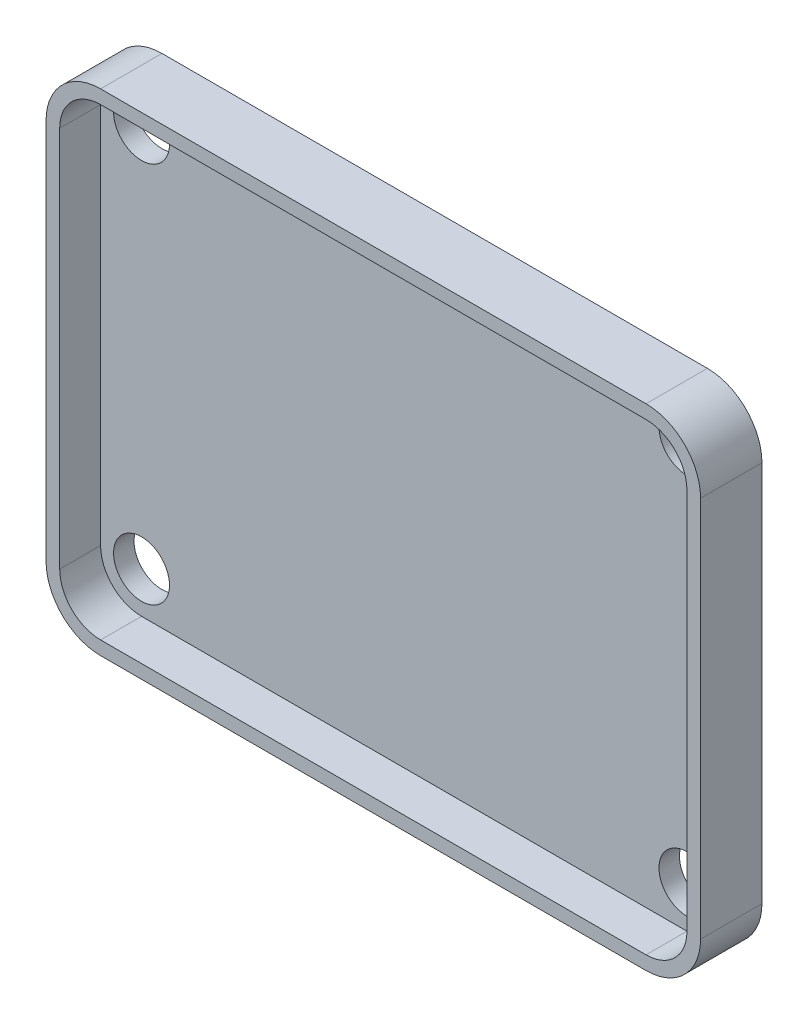
ISO-10303-21;
HEADER;
FILE_DESCRIPTION(('STEP AP214'),'2;1');
FILE_NAME('part.step','',(''),(''),'','','');
FILE_SCHEMA(('AUTOMOTIVE_DESIGN { 1 0 10303 214 1 1 1 1 }'));
ENDSEC;
DATA;
#1=APPLICATION_CONTEXT('core data for automotive mechanical design processes');
#2=APPLICATION_PROTOCOL_DEFINITION('international standard','automotive_design',2000,#1);
#3=PRODUCT_CONTEXT('',#1,'mechanical');
#4=PRODUCT('Part','Part','',(#3));
#5=PRODUCT_RELATED_PRODUCT_CATEGORY('part','',(#4));
#6=PRODUCT_DEFINITION_FORMATION('','',#4);
#7=PRODUCT_DEFINITION_CONTEXT('part definition',#1,'design');
#8=PRODUCT_DEFINITION('design','',#6,#7);
#9=PRODUCT_DEFINITION_SHAPE('','',#8);
#10=(LENGTH_UNIT() NAMED_UNIT(*) SI_UNIT(.MILLI.,.METRE.));
#11=(NAMED_UNIT(*) PLANE_ANGLE_UNIT() SI_UNIT($,.RADIAN.));
#12=(NAMED_UNIT(*) SI_UNIT($,.STERADIAN.) SOLID_ANGLE_UNIT());
#13=UNCERTAINTY_MEASURE_WITH_UNIT(LENGTH_MEASURE(1.E-05),#10,'distance_accuracy_value','');
#14=(GEOMETRIC_REPRESENTATION_CONTEXT(3) GLOBAL_UNCERTAINTY_ASSIGNED_CONTEXT((#13)) GLOBAL_UNIT_ASSIGNED_CONTEXT((#10,
#11,#12)) REPRESENTATION_CONTEXT('',''));
#15=CARTESIAN_POINT('',(0.,0.,0.));
#16=DIRECTION('',(0.,0.,1.));
#17=DIRECTION('',(1.,0.,0.));
#18=AXIS2_PLACEMENT_3D('',#15,#16,#17);
#19=CARTESIAN_POINT('',(-20.,-14.,2.25));
#20=DIRECTION('',(0.,0.,-1.));
#21=DIRECTION('',(-1.,0.,0.));
#22=AXIS2_PLACEMENT_3D('',#19,#20,#21);
#23=CYLINDRICAL_SURFACE('',#22,2.05);
#24=CARTESIAN_POINT('',(-20.,-14.,-2.25));
#25=DIRECTION('',(0.,0.,1.));
#26=DIRECTION('',(1.,0.,0.));
#27=AXIS2_PLACEMENT_3D('',#24,#25,#26);
#28=CIRCLE('',#27,2.05);
#29=CARTESIAN_POINT('',(-17.95,-14.,-2.25));
#30=VERTEX_POINT('',#29);
#31=EDGE_CURVE('E148',#30,#30,#28,.T.);
#32=ORIENTED_EDGE('',*,*,#31,.F.);
#33=EDGE_LOOP('',(#32));
#34=FACE_BOUND('',#33,.T.);
#35=CARTESIAN_POINT('',(-20.,-14.,-0.75));
#36=DIRECTION('',(0.,0.,1.));
#37=DIRECTION('',(1.,0.,0.));
#38=AXIS2_PLACEMENT_3D('',#35,#36,#37);
#39=CIRCLE('',#38,2.05);
#40=CARTESIAN_POINT('',(-17.95,-14.,-0.75));
#41=VERTEX_POINT('',#40);
#42=EDGE_CURVE('E206',#41,#41,#39,.T.);
#43=ORIENTED_EDGE('',*,*,#42,.T.);
#44=EDGE_LOOP('',(#43));
#45=FACE_BOUND('',#44,.T.);
#46=ADVANCED_FACE('F35',(#34,#45),#23,.F.);
#47=CARTESIAN_POINT('',(-20.,14.,2.25));
#48=DIRECTION('',(0.,0.,-1.));
#49=DIRECTION('',(-1.,0.,0.));
#50=AXIS2_PLACEMENT_3D('',#47,#48,#49);
#51=CYLINDRICAL_SURFACE('',#50,2.05);
#52=CARTESIAN_POINT('',(-20.,14.,-2.25));
#53=DIRECTION('',(0.,0.,1.));
#54=DIRECTION('',(1.,0.,0.));
#55=AXIS2_PLACEMENT_3D('',#52,#53,#54);
#56=CIRCLE('',#55,2.05);
#57=CARTESIAN_POINT('',(-17.95,14.,-2.25));
#58=VERTEX_POINT('',#57);
#59=EDGE_CURVE('E197',#58,#58,#56,.T.);
#60=ORIENTED_EDGE('',*,*,#59,.F.);
#61=EDGE_LOOP('',(#60));
#62=FACE_BOUND('',#61,.T.);
#63=CARTESIAN_POINT('',(-20.,14.,-0.75));
#64=DIRECTION('',(0.,0.,1.));
#65=DIRECTION('',(1.,0.,0.));
#66=AXIS2_PLACEMENT_3D('',#63,#64,#65);
#67=CIRCLE('',#66,2.05);
#68=CARTESIAN_POINT('',(-17.95,14.,-0.75));
#69=VERTEX_POINT('',#68);
#70=EDGE_CURVE('E209',#69,#69,#67,.T.);
#71=ORIENTED_EDGE('',*,*,#70,.T.);
#72=EDGE_LOOP('',(#71));
#73=FACE_BOUND('',#72,.T.);
#74=ADVANCED_FACE('F360',(#62,#73),#51,.F.);
#75=CARTESIAN_POINT('',(20.,14.,2.25));
#76=DIRECTION('',(0.,0.,-1.));
#77=DIRECTION('',(-1.,0.,0.));
#78=AXIS2_PLACEMENT_3D('',#75,#76,#77);
#79=CYLINDRICAL_SURFACE('',#78,2.05);
#80=CARTESIAN_POINT('',(20.,14.,-2.25));
#81=DIRECTION('',(0.,0.,1.));
#82=DIRECTION('',(1.,0.,0.));
#83=AXIS2_PLACEMENT_3D('',#80,#81,#82);
#84=CIRCLE('',#83,2.05);
#85=CARTESIAN_POINT('',(22.05,14.,-2.25));
#86=VERTEX_POINT('',#85);
#87=EDGE_CURVE('E200',#86,#86,#84,.T.);
#88=ORIENTED_EDGE('',*,*,#87,.F.);
#89=EDGE_LOOP('',(#88));
#90=FACE_BOUND('',#89,.T.);
#91=CARTESIAN_POINT('',(20.,14.,-0.75));
#92=DIRECTION('',(0.,0.,1.));
#93=DIRECTION('',(1.,0.,0.));
#94=AXIS2_PLACEMENT_3D('',#91,#92,#93);
#95=CIRCLE('',#94,2.05);
#96=CARTESIAN_POINT('',(22.05,14.,-0.75));
#97=VERTEX_POINT('',#96);
#98=EDGE_CURVE('E212',#97,#97,#95,.T.);
#99=ORIENTED_EDGE('',*,*,#98,.T.);
#100=EDGE_LOOP('',(#99));
#101=FACE_BOUND('',#100,.T.);
#102=ADVANCED_FACE('F366',(#90,#101),#79,.F.);
#103=CARTESIAN_POINT('',(20.,-14.,2.25));
#104=DIRECTION('',(0.,0.,-1.));
#105=DIRECTION('',(-1.,0.,0.));
#106=AXIS2_PLACEMENT_3D('',#103,#104,#105);
#107=CYLINDRICAL_SURFACE('',#106,2.05);
#108=CARTESIAN_POINT('',(20.,-14.,-2.25));
#109=DIRECTION('',(0.,0.,1.));
#110=DIRECTION('',(1.,0.,0.));
#111=AXIS2_PLACEMENT_3D('',#108,#109,#110);
#112=CIRCLE('',#111,2.05);
#113=CARTESIAN_POINT('',(22.05,-14.,-2.25));
#114=VERTEX_POINT('',#113);
#115=EDGE_CURVE('E203',#114,#114,#112,.T.);
#116=ORIENTED_EDGE('',*,*,#115,.F.);
#117=EDGE_LOOP('',(#116));
#118=FACE_BOUND('',#117,.T.);
#119=CARTESIAN_POINT('',(20.,-14.,-0.75));
#120=DIRECTION('',(0.,0.,1.));
#121=DIRECTION('',(1.,0.,0.));
#122=AXIS2_PLACEMENT_3D('',#119,#120,#121);
#123=CIRCLE('',#122,2.05);
#124=CARTESIAN_POINT('',(22.05,-14.,-0.75));
#125=VERTEX_POINT('',#124);
#126=EDGE_CURVE('E39',#125,#125,#123,.T.);
#127=ORIENTED_EDGE('',*,*,#126,.T.);
#128=EDGE_LOOP('',(#127));
#129=FACE_BOUND('',#128,.T.);
#130=ADVANCED_FACE('F375',(#118,#129),#107,.F.);
#131=CARTESIAN_POINT('',(-20.,-14.,2.25));
#132=DIRECTION('',(0.,0.,1.));
#133=DIRECTION('',(1.,0.,0.));
#134=AXIS2_PLACEMENT_3D('',#131,#132,#133);
#135=PLANE('',#134);
#136=CARTESIAN_POINT('',(20.,-14.,2.25));
#137=DIRECTION('',(0.,0.,1.));
#138=DIRECTION('',(1.,0.,0.));
#139=AXIS2_PLACEMENT_3D('',#136,#137,#138);
#140=CIRCLE('',#139,3.);
#141=CARTESIAN_POINT('',(20.,-17.,2.25));
#142=VERTEX_POINT('',#141);
#143=CARTESIAN_POINT('',(23.,-14.,2.25));
#144=VERTEX_POINT('',#143);
#145=EDGE_CURVE('E51',#142,#144,#140,.T.);
#146=ORIENTED_EDGE('',*,*,#145,.F.);
#147=DIRECTION('',(1.,0.,0.));
#148=VECTOR('',#147,1.);
#149=CARTESIAN_POINT('',(-20.,-17.,2.25));
#150=LINE('',#149,#148);
#151=CARTESIAN_POINT('',(-20.,-17.,2.25));
#152=VERTEX_POINT('',#151);
#153=EDGE_CURVE('E222',#152,#142,#150,.T.);
#154=ORIENTED_EDGE('',*,*,#153,.F.);
#155=CARTESIAN_POINT('',(-20.,-14.,2.25));
#156=DIRECTION('',(0.,0.,1.));
#157=DIRECTION('',(1.,0.,0.));
#158=AXIS2_PLACEMENT_3D('',#155,#156,#157);
#159=CIRCLE('',#158,3.);
#160=CARTESIAN_POINT('',(-23.,-14.,2.25));
#161=VERTEX_POINT('',#160);
#162=EDGE_CURVE('E245',#161,#152,#159,.T.);
#163=ORIENTED_EDGE('',*,*,#162,.F.);
#164=DIRECTION('',(0.,-1.,0.));
#165=VECTOR('',#164,1.);
#166=CARTESIAN_POINT('',(-23.,14.,2.25));
#167=LINE('',#166,#165);
#168=CARTESIAN_POINT('',(-23.,14.,2.25));
#169=VERTEX_POINT('',#168);
#170=EDGE_CURVE('E248',#169,#161,#167,.T.);
#171=ORIENTED_EDGE('',*,*,#170,.F.);
#172=CARTESIAN_POINT('',(-20.,14.,2.25));
#173=DIRECTION('',(0.,0.,1.));
#174=DIRECTION('',(1.,0.,0.));
#175=AXIS2_PLACEMENT_3D('',#172,#173,#174);
#176=CIRCLE('',#175,3.);
#177=CARTESIAN_POINT('',(-20.,17.,2.25));
#178=VERTEX_POINT('',#177);
#179=EDGE_CURVE('E251',#178,#169,#176,.T.);
#180=ORIENTED_EDGE('',*,*,#179,.F.);
#181=DIRECTION('',(-1.,0.,0.));
#182=VECTOR('',#181,1.);
#183=CARTESIAN_POINT('',(20.,17.,2.25));
#184=LINE('',#183,#182);
#185=CARTESIAN_POINT('',(20.,17.,2.25));
#186=VERTEX_POINT('',#185);
#187=EDGE_CURVE('E254',#186,#178,#184,.T.);
#188=ORIENTED_EDGE('',*,*,#187,.F.);
#189=CARTESIAN_POINT('',(20.,14.,2.25));
#190=DIRECTION('',(0.,0.,1.));
#191=DIRECTION('',(1.,0.,0.));
#192=AXIS2_PLACEMENT_3D('',#189,#190,#191);
#193=CIRCLE('',#192,3.);
#194=CARTESIAN_POINT('',(23.,14.,2.25));
#195=VERTEX_POINT('',#194);
#196=EDGE_CURVE('E257',#195,#186,#193,.T.);
#197=ORIENTED_EDGE('',*,*,#196,.F.);
#198=DIRECTION('',(0.,1.,0.));
#199=VECTOR('',#198,1.);
#200=CARTESIAN_POINT('',(23.,-14.,2.25));
#201=LINE('',#200,#199);
#202=EDGE_CURVE('E260',#144,#195,#201,.T.);
#203=ORIENTED_EDGE('',*,*,#202,.F.);
#204=EDGE_LOOP('',(#146,#154,#163,#171,#180,#188,#197,#203));
#205=FACE_BOUND('',#204,.T.);
#206=CARTESIAN_POINT('',(-20.,-14.,2.25));
#207=DIRECTION('',(0.,0.,1.));
#208=DIRECTION('',(1.,0.,0.));
#209=AXIS2_PLACEMENT_3D('',#206,#207,#208);
#210=CIRCLE('',#209,4.);
#211=CARTESIAN_POINT('',(-24.,-14.,2.25));
#212=VERTEX_POINT('',#211);
#213=CARTESIAN_POINT('',(-20.,-18.,2.25));
#214=VERTEX_POINT('',#213);
#215=EDGE_CURVE('E160',#212,#214,#210,.T.);
#216=ORIENTED_EDGE('',*,*,#215,.T.);
#217=DIRECTION('',(1.,0.,0.));
#218=VECTOR('',#217,1.);
#219=CARTESIAN_POINT('',(-20.,-18.,2.25));
#220=LINE('',#219,#218);
#221=CARTESIAN_POINT('',(20.,-18.,2.25));
#222=VERTEX_POINT('',#221);
#223=EDGE_CURVE('E101',#214,#222,#220,.T.);
#224=ORIENTED_EDGE('',*,*,#223,.T.);
#225=CARTESIAN_POINT('',(20.,-14.,2.25));
#226=DIRECTION('',(0.,0.,1.));
#227=DIRECTION('',(1.,0.,0.));
#228=AXIS2_PLACEMENT_3D('',#225,#226,#227);
#229=CIRCLE('',#228,4.);
#230=CARTESIAN_POINT('',(24.,-14.,2.25));
#231=VERTEX_POINT('',#230);
#232=EDGE_CURVE('E176',#222,#231,#229,.T.);
#233=ORIENTED_EDGE('',*,*,#232,.T.);
#234=DIRECTION('',(0.,1.,0.));
#235=VECTOR('',#234,1.);
#236=CARTESIAN_POINT('',(24.,-14.,2.25));
#237=LINE('',#236,#235);
#238=CARTESIAN_POINT('',(24.,14.,2.25));
#239=VERTEX_POINT('',#238);
#240=EDGE_CURVE('E189',#231,#239,#237,.T.);
#241=ORIENTED_EDGE('',*,*,#240,.T.);
#242=CARTESIAN_POINT('',(20.,14.,2.25));
#243=DIRECTION('',(0.,0.,1.));
#244=DIRECTION('',(1.,0.,0.));
#245=AXIS2_PLACEMENT_3D('',#242,#243,#244);
#246=CIRCLE('',#245,4.);
#247=CARTESIAN_POINT('',(20.,18.,2.25));
#248=VERTEX_POINT('',#247);
#249=EDGE_CURVE('E123',#239,#248,#246,.T.);
#250=ORIENTED_EDGE('',*,*,#249,.T.);
#251=DIRECTION('',(-1.,0.,0.));
#252=VECTOR('',#251,1.);
#253=CARTESIAN_POINT('',(-20.,18.,2.25));
#254=LINE('',#253,#252);
#255=CARTESIAN_POINT('',(-20.,18.,2.25));
#256=VERTEX_POINT('',#255);
#257=EDGE_CURVE('E116',#248,#256,#254,.T.);
#258=ORIENTED_EDGE('',*,*,#257,.T.);
#259=CARTESIAN_POINT('',(-20.,14.,2.25));
#260=DIRECTION('',(0.,0.,1.));
#261=DIRECTION('',(1.,0.,0.));
#262=AXIS2_PLACEMENT_3D('',#259,#260,#261);
#263=CIRCLE('',#262,4.);
#264=CARTESIAN_POINT('',(-24.,14.,2.25));
#265=VERTEX_POINT('',#264);
#266=EDGE_CURVE('E120',#256,#265,#263,.T.);
#267=ORIENTED_EDGE('',*,*,#266,.T.);
#268=DIRECTION('',(0.,-1.,0.));
#269=VECTOR('',#268,1.);
#270=CARTESIAN_POINT('',(-24.,-14.,2.25));
#271=LINE('',#270,#269);
#272=EDGE_CURVE('E60',#265,#212,#271,.T.);
#273=ORIENTED_EDGE('',*,*,#272,.T.);
#274=EDGE_LOOP('',(#216,#224,#233,#241,#250,#258,#267,#273));
#275=FACE_BOUND('',#274,.T.);
#276=ADVANCED_FACE('F118',(#205,#275),#135,.T.);
#277=CARTESIAN_POINT('',(-20.,-14.,-2.25));
#278=DIRECTION('',(0.,0.,1.));
#279=DIRECTION('',(1.,0.,0.));
#280=AXIS2_PLACEMENT_3D('',#277,#278,#279);
#281=PLANE('',#280);
#282=ORIENTED_EDGE('',*,*,#87,.T.);
#283=EDGE_LOOP('',(#282));
#284=FACE_BOUND('',#283,.T.);
#285=ORIENTED_EDGE('',*,*,#31,.T.);
#286=EDGE_LOOP('',(#285));
#287=FACE_BOUND('',#286,.T.);
#288=CARTESIAN_POINT('',(-20.,-14.,-2.25));
#289=DIRECTION('',(0.,0.,1.));
#290=DIRECTION('',(1.,0.,0.));
#291=AXIS2_PLACEMENT_3D('',#288,#289,#290);
#292=CIRCLE('',#291,4.);
#293=CARTESIAN_POINT('',(-24.,-14.,-2.25));
#294=VERTEX_POINT('',#293);
#295=CARTESIAN_POINT('',(-20.,-18.,-2.25));
#296=VERTEX_POINT('',#295);
#297=EDGE_CURVE('E144',#294,#296,#292,.T.);
#298=ORIENTED_EDGE('',*,*,#297,.F.);
#299=DIRECTION('',(0.,-1.,0.));
#300=VECTOR('',#299,1.);
#301=CARTESIAN_POINT('',(-24.,-14.,-2.25));
#302=LINE('',#301,#300);
#303=CARTESIAN_POINT('',(-24.,14.,-2.25));
#304=VERTEX_POINT('',#303);
#305=EDGE_CURVE('E93',#304,#294,#302,.T.);
#306=ORIENTED_EDGE('',*,*,#305,.F.);
#307=CARTESIAN_POINT('',(-20.,14.,-2.25));
#308=DIRECTION('',(0.,0.,1.));
#309=DIRECTION('',(1.,0.,0.));
#310=AXIS2_PLACEMENT_3D('',#307,#308,#309);
#311=CIRCLE('',#310,4.);
#312=CARTESIAN_POINT('',(-20.,18.,-2.25));
#313=VERTEX_POINT('',#312);
#314=EDGE_CURVE('E157',#313,#304,#311,.T.);
#315=ORIENTED_EDGE('',*,*,#314,.F.);
#316=DIRECTION('',(-1.,0.,0.));
#317=VECTOR('',#316,1.);
#318=CARTESIAN_POINT('',(-20.,18.,-2.25));
#319=LINE('',#318,#317);
#320=CARTESIAN_POINT('',(20.,18.,-2.25));
#321=VERTEX_POINT('',#320);
#322=EDGE_CURVE('E132',#321,#313,#319,.T.);
#323=ORIENTED_EDGE('',*,*,#322,.F.);
#324=CARTESIAN_POINT('',(20.,14.,-2.25));
#325=DIRECTION('',(0.,0.,1.));
#326=DIRECTION('',(1.,0.,0.));
#327=AXIS2_PLACEMENT_3D('',#324,#325,#326);
#328=CIRCLE('',#327,4.);
#329=CARTESIAN_POINT('',(24.,14.,-2.25));
#330=VERTEX_POINT('',#329);
#331=EDGE_CURVE('E154',#330,#321,#328,.T.);
#332=ORIENTED_EDGE('',*,*,#331,.F.);
#333=DIRECTION('',(0.,1.,0.));
#334=VECTOR('',#333,1.);
#335=CARTESIAN_POINT('',(24.,-14.,-2.25));
#336=LINE('',#335,#334);
#337=CARTESIAN_POINT('',(24.,-14.,-2.25));
#338=VERTEX_POINT('',#337);
#339=EDGE_CURVE('E152',#338,#330,#336,.T.);
#340=ORIENTED_EDGE('',*,*,#339,.F.);
#341=CARTESIAN_POINT('',(20.,-14.,-2.25));
#342=DIRECTION('',(0.,0.,1.));
#343=DIRECTION('',(1.,0.,0.));
#344=AXIS2_PLACEMENT_3D('',#341,#342,#343);
#345=CIRCLE('',#344,4.);
#346=CARTESIAN_POINT('',(20.,-18.,-2.25));
#347=VERTEX_POINT('',#346);
#348=EDGE_CURVE('E150',#347,#338,#345,.T.);
#349=ORIENTED_EDGE('',*,*,#348,.F.);
#350=DIRECTION('',(1.,0.,0.));
#351=VECTOR('',#350,1.);
#352=CARTESIAN_POINT('',(-20.,-18.,-2.25));
#353=LINE('',#352,#351);
#354=EDGE_CURVE('E147',#296,#347,#353,.T.);
#355=ORIENTED_EDGE('',*,*,#354,.F.);
#356=EDGE_LOOP('',(#298,#306,#315,#323,#332,#340,#349,#355));
#357=FACE_BOUND('',#356,.T.);
#358=ORIENTED_EDGE('',*,*,#59,.T.);
#359=EDGE_LOOP('',(#358));
#360=FACE_BOUND('',#359,.T.);
#361=ORIENTED_EDGE('',*,*,#115,.T.);
#362=EDGE_LOOP('',(#361));
#363=FACE_BOUND('',#362,.T.);
#364=ADVANCED_FACE('F180',(#284,#287,#357,#360,#363),#281,.F.);
#365=CARTESIAN_POINT('',(-20.,-14.,2.25));
#366=DIRECTION('',(0.,0.,-1.));
#367=DIRECTION('',(-1.,0.,0.));
#368=AXIS2_PLACEMENT_3D('',#365,#366,#367);
#369=CYLINDRICAL_SURFACE('',#368,4.);
#370=ORIENTED_EDGE('',*,*,#297,.T.);
#371=DIRECTION('',(0.,0.,-1.));
#372=VECTOR('',#371,1.);
#373=CARTESIAN_POINT('',(-20.,-18.,2.25));
#374=LINE('',#373,#372);
#375=EDGE_CURVE('E12',#214,#296,#374,.T.);
#376=ORIENTED_EDGE('',*,*,#375,.F.);
#377=ORIENTED_EDGE('',*,*,#215,.F.);
#378=DIRECTION('',(0.,0.,-1.));
#379=VECTOR('',#378,1.);
#380=CARTESIAN_POINT('',(-24.,-14.,2.25));
#381=LINE('',#380,#379);
#382=EDGE_CURVE('E140',#212,#294,#381,.T.);
#383=ORIENTED_EDGE('',*,*,#382,.T.);
#384=EDGE_LOOP('',(#370,#376,#377,#383));
#385=FACE_BOUND('',#384,.T.);
#386=ADVANCED_FACE('F37',(#385),#369,.T.);
#387=CARTESIAN_POINT('',(-20.,-18.,2.25));
#388=DIRECTION('',(0.,1.,0.));
#389=DIRECTION('',(0.,0.,1.));
#390=AXIS2_PLACEMENT_3D('',#387,#388,#389);
#391=PLANE('',#390);
#392=ORIENTED_EDGE('',*,*,#354,.T.);
#393=DIRECTION('',(0.,0.,-1.));
#394=VECTOR('',#393,1.);
#395=CARTESIAN_POINT('',(20.,-18.,2.25));
#396=LINE('',#395,#394);
#397=EDGE_CURVE('E44',#222,#347,#396,.T.);
#398=ORIENTED_EDGE('',*,*,#397,.F.);
#399=ORIENTED_EDGE('',*,*,#223,.F.);
#400=ORIENTED_EDGE('',*,*,#375,.T.);
#401=EDGE_LOOP('',(#392,#398,#399,#400));
#402=FACE_BOUND('',#401,.T.);
#403=ADVANCED_FACE('F390',(#402),#391,.F.);
#404=CARTESIAN_POINT('',(20.,-14.,2.25));
#405=DIRECTION('',(0.,0.,-1.));
#406=DIRECTION('',(-1.,0.,0.));
#407=AXIS2_PLACEMENT_3D('',#404,#405,#406);
#408=CYLINDRICAL_SURFACE('',#407,4.);
#409=ORIENTED_EDGE('',*,*,#348,.T.);
#410=DIRECTION('',(0.,0.,-1.));
#411=VECTOR('',#410,1.);
#412=CARTESIAN_POINT('',(24.,-14.,2.25));
#413=LINE('',#412,#411);
#414=EDGE_CURVE('E167',#231,#338,#413,.T.);
#415=ORIENTED_EDGE('',*,*,#414,.F.);
#416=ORIENTED_EDGE('',*,*,#232,.F.);
#417=ORIENTED_EDGE('',*,*,#397,.T.);
#418=EDGE_LOOP('',(#409,#415,#416,#417));
#419=FACE_BOUND('',#418,.T.);
#420=ADVANCED_FACE('F174',(#419),#408,.T.);
#421=CARTESIAN_POINT('',(24.,-14.,2.25));
#422=DIRECTION('',(-1.,0.,0.));
#423=DIRECTION('',(0.,0.,1.));
#424=AXIS2_PLACEMENT_3D('',#421,#422,#423);
#425=PLANE('',#424);
#426=ORIENTED_EDGE('',*,*,#339,.T.);
#427=DIRECTION('',(0.,0.,-1.));
#428=VECTOR('',#427,1.);
#429=CARTESIAN_POINT('',(24.,14.,2.25));
#430=LINE('',#429,#428);
#431=EDGE_CURVE('E164',#239,#330,#430,.T.);
#432=ORIENTED_EDGE('',*,*,#431,.F.);
#433=ORIENTED_EDGE('',*,*,#240,.F.);
#434=ORIENTED_EDGE('',*,*,#414,.T.);
#435=EDGE_LOOP('',(#426,#432,#433,#434));
#436=FACE_BOUND('',#435,.T.);
#437=ADVANCED_FACE('F185',(#436),#425,.F.);
#438=CARTESIAN_POINT('',(20.,14.,2.25));
#439=DIRECTION('',(0.,0.,-1.));
#440=DIRECTION('',(-1.,0.,0.));
#441=AXIS2_PLACEMENT_3D('',#438,#439,#440);
#442=CYLINDRICAL_SURFACE('',#441,4.);
#443=ORIENTED_EDGE('',*,*,#331,.T.);
#444=DIRECTION('',(0.,0.,-1.));
#445=VECTOR('',#444,1.);
#446=CARTESIAN_POINT('',(20.,18.,2.25));
#447=LINE('',#446,#445);
#448=EDGE_CURVE('E135',#248,#321,#447,.T.);
#449=ORIENTED_EDGE('',*,*,#448,.F.);
#450=ORIENTED_EDGE('',*,*,#249,.F.);
#451=ORIENTED_EDGE('',*,*,#431,.T.);
#452=EDGE_LOOP('',(#443,#449,#450,#451));
#453=FACE_BOUND('',#452,.T.);
#454=ADVANCED_FACE('F188',(#453),#442,.T.);
#455=CARTESIAN_POINT('',(-20.,18.,2.25));
#456=DIRECTION('',(0.,-1.,0.));
#457=DIRECTION('',(0.,0.,-1.));
#458=AXIS2_PLACEMENT_3D('',#455,#456,#457);
#459=PLANE('',#458);
#460=ORIENTED_EDGE('',*,*,#322,.T.);
#461=DIRECTION('',(0.,0.,-1.));
#462=VECTOR('',#461,1.);
#463=CARTESIAN_POINT('',(-20.,18.,2.25));
#464=LINE('',#463,#462);
#465=EDGE_CURVE('E129',#256,#313,#464,.T.);
#466=ORIENTED_EDGE('',*,*,#465,.F.);
#467=ORIENTED_EDGE('',*,*,#257,.F.);
#468=ORIENTED_EDGE('',*,*,#448,.T.);
#469=EDGE_LOOP('',(#460,#466,#467,#468));
#470=FACE_BOUND('',#469,.T.);
#471=ADVANCED_FACE('F130',(#470),#459,.F.);
#472=CARTESIAN_POINT('',(-20.,14.,2.25));
#473=DIRECTION('',(0.,0.,-1.));
#474=DIRECTION('',(-1.,0.,0.));
#475=AXIS2_PLACEMENT_3D('',#472,#473,#474);
#476=CYLINDRICAL_SURFACE('',#475,4.);
#477=ORIENTED_EDGE('',*,*,#314,.T.);
#478=DIRECTION('',(0.,0.,-1.));
#479=VECTOR('',#478,1.);
#480=CARTESIAN_POINT('',(-24.,14.,2.25));
#481=LINE('',#480,#479);
#482=EDGE_CURVE('E136',#265,#304,#481,.T.);
#483=ORIENTED_EDGE('',*,*,#482,.F.);
#484=ORIENTED_EDGE('',*,*,#266,.F.);
#485=ORIENTED_EDGE('',*,*,#465,.T.);
#486=EDGE_LOOP('',(#477,#483,#484,#485));
#487=FACE_BOUND('',#486,.T.);
#488=ADVANCED_FACE('F138',(#487),#476,.T.);
#489=CARTESIAN_POINT('',(-24.,-14.,2.25));
#490=DIRECTION('',(1.,0.,0.));
#491=DIRECTION('',(0.,0.,-1.));
#492=AXIS2_PLACEMENT_3D('',#489,#490,#491);
#493=PLANE('',#492);
#494=ORIENTED_EDGE('',*,*,#305,.T.);
#495=ORIENTED_EDGE('',*,*,#382,.F.);
#496=ORIENTED_EDGE('',*,*,#272,.F.);
#497=ORIENTED_EDGE('',*,*,#482,.T.);
#498=EDGE_LOOP('',(#494,#495,#496,#497));
#499=FACE_BOUND('',#498,.T.);
#500=ADVANCED_FACE('F356',(#499),#493,.F.);
#501=CARTESIAN_POINT('',(20.,-14.,-59.4513985843004));
#502=DIRECTION('',(0.,0.,1.));
#503=DIRECTION('',(1.,0.,0.));
#504=AXIS2_PLACEMENT_3D('',#501,#502,#503);
#505=CYLINDRICAL_SURFACE('',#504,3.);
#506=CARTESIAN_POINT('',(20.,-14.,-0.750000000000001));
#507=DIRECTION('',(0.,0.,1.));
#508=DIRECTION('',(1.,0.,0.));
#509=AXIS2_PLACEMENT_3D('',#506,#507,#508);
#510=CIRCLE('',#509,3.);
#511=CARTESIAN_POINT('',(23.,-14.,-0.750000000000001));
#512=VERTEX_POINT('',#511);
#513=CARTESIAN_POINT('',(20.,-17.,-0.750000000000001));
#514=VERTEX_POINT('',#513);
#515=EDGE_CURVE('E218',#512,#514,#510,.F.);
#516=ORIENTED_EDGE('',*,*,#515,.T.);
#517=DIRECTION('',(0.,0.,1.));
#518=VECTOR('',#517,1.);
#519=CARTESIAN_POINT('',(20.,-17.,-59.4513985843004));
#520=LINE('',#519,#518);
#521=EDGE_CURVE('E240',#514,#142,#520,.T.);
#522=ORIENTED_EDGE('',*,*,#521,.T.);
#523=ORIENTED_EDGE('',*,*,#145,.T.);
#524=DIRECTION('',(0.,0.,1.));
#525=VECTOR('',#524,1.);
#526=CARTESIAN_POINT('',(23.,-14.,-59.4513985843004));
#527=LINE('',#526,#525);
#528=EDGE_CURVE('E219',#512,#144,#527,.T.);
#529=ORIENTED_EDGE('',*,*,#528,.F.);
#530=EDGE_LOOP('',(#516,#522,#523,#529));
#531=FACE_BOUND('',#530,.T.);
#532=ADVANCED_FACE('F306',(#531),#505,.F.);
#533=CARTESIAN_POINT('',(-20.,-17.,-59.4513985843004));
#534=DIRECTION('',(0.,-1.,0.));
#535=DIRECTION('',(0.,0.,-1.));
#536=AXIS2_PLACEMENT_3D('',#533,#534,#535);
#537=PLANE('',#536);
#538=DIRECTION('',(-1.,0.,0.));
#539=VECTOR('',#538,1.);
#540=CARTESIAN_POINT('',(-20.,-17.,-0.750000000000001));
#541=LINE('',#540,#539);
#542=CARTESIAN_POINT('',(-20.,-17.,-0.750000000000001));
#543=VERTEX_POINT('',#542);
#544=EDGE_CURVE('E266',#514,#543,#541,.T.);
#545=ORIENTED_EDGE('',*,*,#544,.T.);
#546=DIRECTION('',(0.,0.,1.));
#547=VECTOR('',#546,1.);
#548=CARTESIAN_POINT('',(-20.,-17.,-59.4513985843004));
#549=LINE('',#548,#547);
#550=EDGE_CURVE('E237',#543,#152,#549,.T.);
#551=ORIENTED_EDGE('',*,*,#550,.T.);
#552=ORIENTED_EDGE('',*,*,#153,.T.);
#553=ORIENTED_EDGE('',*,*,#521,.F.);
#554=EDGE_LOOP('',(#545,#551,#552,#553));
#555=FACE_BOUND('',#554,.T.);
#556=ADVANCED_FACE('F348',(#555),#537,.F.);
#557=CARTESIAN_POINT('',(-20.,-14.,-59.4513985843004));
#558=DIRECTION('',(0.,0.,1.));
#559=DIRECTION('',(1.,0.,0.));
#560=AXIS2_PLACEMENT_3D('',#557,#558,#559);
#561=CYLINDRICAL_SURFACE('',#560,3.);
#562=CARTESIAN_POINT('',(-20.,-14.,-0.750000000000001));
#563=DIRECTION('',(0.,0.,1.));
#564=DIRECTION('',(1.,0.,0.));
#565=AXIS2_PLACEMENT_3D('',#562,#563,#564);
#566=CIRCLE('',#565,3.);
#567=CARTESIAN_POINT('',(-23.,-14.,-0.750000000000001));
#568=VERTEX_POINT('',#567);
#569=EDGE_CURVE('E269',#543,#568,#566,.F.);
#570=ORIENTED_EDGE('',*,*,#569,.T.);
#571=DIRECTION('',(0.,0.,1.));
#572=VECTOR('',#571,1.);
#573=CARTESIAN_POINT('',(-23.,-14.,-59.4513985843004));
#574=LINE('',#573,#572);
#575=EDGE_CURVE('E234',#568,#161,#574,.T.);
#576=ORIENTED_EDGE('',*,*,#575,.T.);
#577=ORIENTED_EDGE('',*,*,#162,.T.);
#578=ORIENTED_EDGE('',*,*,#550,.F.);
#579=EDGE_LOOP('',(#570,#576,#577,#578));
#580=FACE_BOUND('',#579,.T.);
#581=ADVANCED_FACE('F345',(#580),#561,.F.);
#582=CARTESIAN_POINT('',(-23.,14.,-59.4513985843004));
#583=DIRECTION('',(-1.,0.,0.));
#584=DIRECTION('',(0.,0.,1.));
#585=AXIS2_PLACEMENT_3D('',#582,#583,#584);
#586=PLANE('',#585);
#587=DIRECTION('',(0.,1.,0.));
#588=VECTOR('',#587,1.);
#589=CARTESIAN_POINT('',(-23.,14.,-0.750000000000001));
#590=LINE('',#589,#588);
#591=CARTESIAN_POINT('',(-23.,14.,-0.750000000000001));
#592=VERTEX_POINT('',#591);
#593=EDGE_CURVE('E272',#568,#592,#590,.T.);
#594=ORIENTED_EDGE('',*,*,#593,.T.);
#595=DIRECTION('',(0.,0.,1.));
#596=VECTOR('',#595,1.);
#597=CARTESIAN_POINT('',(-23.,14.,-59.4513985843004));
#598=LINE('',#597,#596);
#599=EDGE_CURVE('E231',#592,#169,#598,.T.);
#600=ORIENTED_EDGE('',*,*,#599,.T.);
#601=ORIENTED_EDGE('',*,*,#170,.T.);
#602=ORIENTED_EDGE('',*,*,#575,.F.);
#603=EDGE_LOOP('',(#594,#600,#601,#602));
#604=FACE_BOUND('',#603,.T.);
#605=ADVANCED_FACE('F342',(#604),#586,.F.);
#606=CARTESIAN_POINT('',(-20.,14.,-59.4513985843004));
#607=DIRECTION('',(0.,0.,1.));
#608=DIRECTION('',(1.,0.,0.));
#609=AXIS2_PLACEMENT_3D('',#606,#607,#608);
#610=CYLINDRICAL_SURFACE('',#609,3.);
#611=CARTESIAN_POINT('',(-20.,14.,-0.750000000000001));
#612=DIRECTION('',(0.,0.,1.));
#613=DIRECTION('',(1.,0.,0.));
#614=AXIS2_PLACEMENT_3D('',#611,#612,#613);
#615=CIRCLE('',#614,3.);
#616=CARTESIAN_POINT('',(-20.,17.,-0.750000000000001));
#617=VERTEX_POINT('',#616);
#618=EDGE_CURVE('E275',#592,#617,#615,.F.);
#619=ORIENTED_EDGE('',*,*,#618,.T.);
#620=DIRECTION('',(0.,0.,1.));
#621=VECTOR('',#620,1.);
#622=CARTESIAN_POINT('',(-20.,17.,-59.4513985843004));
#623=LINE('',#622,#621);
#624=EDGE_CURVE('E228',#617,#178,#623,.T.);
#625=ORIENTED_EDGE('',*,*,#624,.T.);
#626=ORIENTED_EDGE('',*,*,#179,.T.);
#627=ORIENTED_EDGE('',*,*,#599,.F.);
#628=EDGE_LOOP('',(#619,#625,#626,#627));
#629=FACE_BOUND('',#628,.T.);
#630=ADVANCED_FACE('F339',(#629),#610,.F.);
#631=CARTESIAN_POINT('',(20.,17.,-59.4513985843004));
#632=DIRECTION('',(0.,1.,0.));
#633=DIRECTION('',(0.,0.,1.));
#634=AXIS2_PLACEMENT_3D('',#631,#632,#633);
#635=PLANE('',#634);
#636=DIRECTION('',(1.,0.,0.));
#637=VECTOR('',#636,1.);
#638=CARTESIAN_POINT('',(20.,17.,-0.750000000000001));
#639=LINE('',#638,#637);
#640=CARTESIAN_POINT('',(20.,17.,-0.750000000000001));
#641=VERTEX_POINT('',#640);
#642=EDGE_CURVE('E278',#617,#641,#639,.T.);
#643=ORIENTED_EDGE('',*,*,#642,.T.);
#644=DIRECTION('',(0.,0.,1.));
#645=VECTOR('',#644,1.);
#646=CARTESIAN_POINT('',(20.,17.,-59.4513985843004));
#647=LINE('',#646,#645);
#648=EDGE_CURVE('E225',#641,#186,#647,.T.);
#649=ORIENTED_EDGE('',*,*,#648,.T.);
#650=ORIENTED_EDGE('',*,*,#187,.T.);
#651=ORIENTED_EDGE('',*,*,#624,.F.);
#652=EDGE_LOOP('',(#643,#649,#650,#651));
#653=FACE_BOUND('',#652,.T.);
#654=ADVANCED_FACE('F336',(#653),#635,.F.);
#655=CARTESIAN_POINT('',(20.,14.,-59.4513985843004));
#656=DIRECTION('',(0.,0.,1.));
#657=DIRECTION('',(1.,0.,0.));
#658=AXIS2_PLACEMENT_3D('',#655,#656,#657);
#659=CYLINDRICAL_SURFACE('',#658,3.);
#660=CARTESIAN_POINT('',(20.,14.,-0.750000000000001));
#661=DIRECTION('',(0.,0.,1.));
#662=DIRECTION('',(1.,0.,0.));
#663=AXIS2_PLACEMENT_3D('',#660,#661,#662);
#664=CIRCLE('',#663,3.);
#665=CARTESIAN_POINT('',(23.,14.,-0.750000000000015));
#666=VERTEX_POINT('',#665);
#667=EDGE_CURVE('E242',#641,#666,#664,.F.);
#668=ORIENTED_EDGE('',*,*,#667,.T.);
#669=DIRECTION('',(0.,0.,1.));
#670=VECTOR('',#669,1.);
#671=CARTESIAN_POINT('',(23.,14.,-59.4513985843004));
#672=LINE('',#671,#670);
#673=EDGE_CURVE('E221',#666,#195,#672,.T.);
#674=ORIENTED_EDGE('',*,*,#673,.T.);
#675=ORIENTED_EDGE('',*,*,#196,.T.);
#676=ORIENTED_EDGE('',*,*,#648,.F.);
#677=EDGE_LOOP('',(#668,#674,#675,#676));
#678=FACE_BOUND('',#677,.T.);
#679=ADVANCED_FACE('F287',(#678),#659,.F.);
#680=CARTESIAN_POINT('',(23.,-14.,-59.4513985843004));
#681=DIRECTION('',(1.,0.,0.));
#682=DIRECTION('',(0.,0.,-1.));
#683=AXIS2_PLACEMENT_3D('',#680,#681,#682);
#684=PLANE('',#683);
#685=DIRECTION('',(0.,-1.,0.));
#686=VECTOR('',#685,1.);
#687=CARTESIAN_POINT('',(23.,-14.,-0.750000000000001));
#688=LINE('',#687,#686);
#689=EDGE_CURVE('E215',#666,#512,#688,.T.);
#690=ORIENTED_EDGE('',*,*,#689,.T.);
#691=ORIENTED_EDGE('',*,*,#528,.T.);
#692=ORIENTED_EDGE('',*,*,#202,.T.);
#693=ORIENTED_EDGE('',*,*,#673,.F.);
#694=EDGE_LOOP('',(#690,#691,#692,#693));
#695=FACE_BOUND('',#694,.T.);
#696=ADVANCED_FACE('F296',(#695),#684,.F.);
#697=CARTESIAN_POINT('',(-20.,-14.,-0.75));
#698=DIRECTION('',(0.,0.,1.));
#699=DIRECTION('',(1.,0.,0.));
#700=AXIS2_PLACEMENT_3D('',#697,#698,#699);
#701=PLANE('',#700);
#702=ORIENTED_EDGE('',*,*,#42,.F.);
#703=EDGE_LOOP('',(#702));
#704=FACE_BOUND('',#703,.T.);
#705=ORIENTED_EDGE('',*,*,#70,.F.);
#706=EDGE_LOOP('',(#705));
#707=FACE_BOUND('',#706,.T.);
#708=ORIENTED_EDGE('',*,*,#98,.F.);
#709=EDGE_LOOP('',(#708));
#710=FACE_BOUND('',#709,.T.);
#711=ORIENTED_EDGE('',*,*,#126,.F.);
#712=EDGE_LOOP('',(#711));
#713=FACE_BOUND('',#712,.T.);
#714=ORIENTED_EDGE('',*,*,#515,.F.);
#715=ORIENTED_EDGE('',*,*,#689,.F.);
#716=ORIENTED_EDGE('',*,*,#667,.F.);
#717=ORIENTED_EDGE('',*,*,#642,.F.);
#718=ORIENTED_EDGE('',*,*,#618,.F.);
#719=ORIENTED_EDGE('',*,*,#593,.F.);
#720=ORIENTED_EDGE('',*,*,#569,.F.);
#721=ORIENTED_EDGE('',*,*,#544,.F.);
#722=EDGE_LOOP('',(#714,#715,#716,#717,#718,#719,#720,#721));
#723=FACE_BOUND('',#722,.T.);
#724=ADVANCED_FACE('F300',(#704,#707,#710,#713,#723),#701,.T.);
#725=CLOSED_SHELL('',(#46,#74,#102,#130,#276,#364,#386,#403,#420,#437,#454,#471,#488,#500,#532,
#556,#581,#605,#630,#654,#679,#696,#724));
#726=MANIFOLD_SOLID_BREP('B2',#725);
#727=ADVANCED_BREP_SHAPE_REPRESENTATION('',(#18,#726),#14);
#728=SHAPE_DEFINITION_REPRESENTATION(#9,#727);
ENDSEC;
END-ISO-10303-21;
